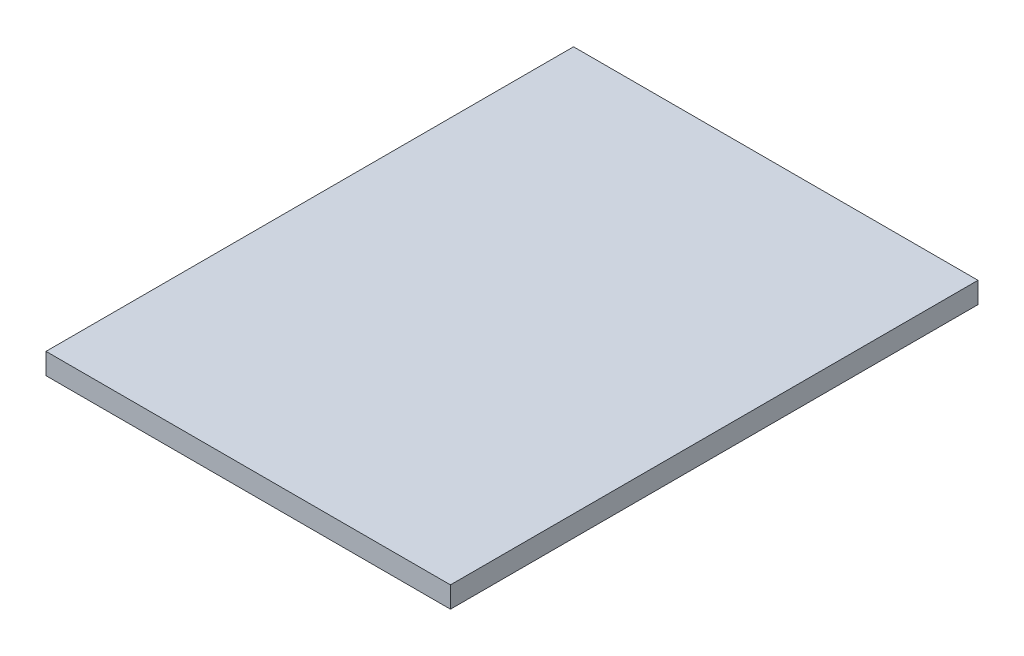
ISO-10303-21;
HEADER;
FILE_DESCRIPTION(('STEP AP214'),'2;1');
FILE_NAME('part.step','',(''),(''),'','','');
FILE_SCHEMA(('AUTOMOTIVE_DESIGN { 1 0 10303 214 1 1 1 1 }'));
ENDSEC;
DATA;
#1=APPLICATION_CONTEXT('core data for automotive mechanical design processes');
#2=APPLICATION_PROTOCOL_DEFINITION('international standard','automotive_design',2000,#1);
#3=PRODUCT_CONTEXT('',#1,'mechanical');
#4=PRODUCT('Part','Part','',(#3));
#5=PRODUCT_RELATED_PRODUCT_CATEGORY('part','',(#4));
#6=PRODUCT_DEFINITION_FORMATION('','',#4);
#7=PRODUCT_DEFINITION_CONTEXT('part definition',#1,'design');
#8=PRODUCT_DEFINITION('design','',#6,#7);
#9=PRODUCT_DEFINITION_SHAPE('','',#8);
#10=(LENGTH_UNIT() NAMED_UNIT(*) SI_UNIT(.MILLI.,.METRE.));
#11=(NAMED_UNIT(*) PLANE_ANGLE_UNIT() SI_UNIT($,.RADIAN.));
#12=(NAMED_UNIT(*) SI_UNIT($,.STERADIAN.) SOLID_ANGLE_UNIT());
#13=UNCERTAINTY_MEASURE_WITH_UNIT(LENGTH_MEASURE(1.E-05),#10,'distance_accuracy_value','');
#14=(GEOMETRIC_REPRESENTATION_CONTEXT(3) GLOBAL_UNCERTAINTY_ASSIGNED_CONTEXT((#13)) GLOBAL_UNIT_ASSIGNED_CONTEXT((#10,
#11,#12)) REPRESENTATION_CONTEXT('',''));
#15=CARTESIAN_POINT('',(0.,0.,0.));
#16=DIRECTION('',(0.,0.,1.));
#17=DIRECTION('',(1.,0.,0.));
#18=AXIS2_PLACEMENT_3D('',#15,#16,#17);
#19=CARTESIAN_POINT('',(-57.5,-6.,75.));
#20=DIRECTION('',(-1.,0.,0.));
#21=DIRECTION('',(0.,0.,1.));
#22=AXIS2_PLACEMENT_3D('',#19,#20,#21);
#23=PLANE('',#22);
#24=DIRECTION('',(0.,0.,1.));
#25=VECTOR('',#24,1.);
#26=CARTESIAN_POINT('',(-57.5,0.,75.));
#27=LINE('',#26,#25);
#28=CARTESIAN_POINT('',(-57.5,0.,-75.));
#29=VERTEX_POINT('',#28);
#30=CARTESIAN_POINT('',(-57.5,0.,75.));
#31=VERTEX_POINT('',#30);
#32=EDGE_CURVE('E100',#29,#31,#27,.T.);
#33=ORIENTED_EDGE('',*,*,#32,.F.);
#34=DIRECTION('',(0.,1.,0.));
#35=VECTOR('',#34,1.);
#36=CARTESIAN_POINT('',(-57.5,-6.,-75.));
#37=LINE('',#36,#35);
#38=CARTESIAN_POINT('',(-57.5,-6.,-75.));
#39=VERTEX_POINT('',#38);
#40=EDGE_CURVE('E11',#39,#29,#37,.T.);
#41=ORIENTED_EDGE('',*,*,#40,.F.);
#42=DIRECTION('',(0.,0.,1.));
#43=VECTOR('',#42,1.);
#44=CARTESIAN_POINT('',(-57.5,-6.,75.));
#45=LINE('',#44,#43);
#46=CARTESIAN_POINT('',(-57.5,-6.,75.));
#47=VERTEX_POINT('',#46);
#48=EDGE_CURVE('E94',#39,#47,#45,.T.);
#49=ORIENTED_EDGE('',*,*,#48,.T.);
#50=DIRECTION('',(0.,1.,0.));
#51=VECTOR('',#50,1.);
#52=CARTESIAN_POINT('',(-57.5,-6.,75.));
#53=LINE('',#52,#51);
#54=EDGE_CURVE('E39',#47,#31,#53,.T.);
#55=ORIENTED_EDGE('',*,*,#54,.T.);
#56=EDGE_LOOP('',(#33,#41,#49,#55));
#57=FACE_BOUND('',#56,.T.);
#58=ADVANCED_FACE('F36',(#57),#23,.T.);
#59=CARTESIAN_POINT('',(-57.5,-6.,-75.));
#60=DIRECTION('',(0.,0.,-1.));
#61=DIRECTION('',(-1.,0.,0.));
#62=AXIS2_PLACEMENT_3D('',#59,#60,#61);
#63=PLANE('',#62);
#64=DIRECTION('',(-1.,0.,0.));
#65=VECTOR('',#64,1.);
#66=CARTESIAN_POINT('',(-57.5,0.,-75.));
#67=LINE('',#66,#65);
#68=CARTESIAN_POINT('',(57.5,0.,-75.));
#69=VERTEX_POINT('',#68);
#70=EDGE_CURVE('E96',#69,#29,#67,.T.);
#71=ORIENTED_EDGE('',*,*,#70,.F.);
#72=DIRECTION('',(0.,1.,0.));
#73=VECTOR('',#72,1.);
#74=CARTESIAN_POINT('',(57.5,-6.,-75.));
#75=LINE('',#74,#73);
#76=CARTESIAN_POINT('',(57.5,-6.,-75.));
#77=VERTEX_POINT('',#76);
#78=EDGE_CURVE('E45',#77,#69,#75,.T.);
#79=ORIENTED_EDGE('',*,*,#78,.F.);
#80=DIRECTION('',(-1.,0.,0.));
#81=VECTOR('',#80,1.);
#82=CARTESIAN_POINT('',(-57.5,-6.,-75.));
#83=LINE('',#82,#81);
#84=EDGE_CURVE('E91',#77,#39,#83,.T.);
#85=ORIENTED_EDGE('',*,*,#84,.T.);
#86=ORIENTED_EDGE('',*,*,#40,.T.);
#87=EDGE_LOOP('',(#71,#79,#85,#86));
#88=FACE_BOUND('',#87,.T.);
#89=ADVANCED_FACE('F110',(#88),#63,.T.);
#90=CARTESIAN_POINT('',(57.5,-6.,75.));
#91=DIRECTION('',(1.,0.,0.));
#92=DIRECTION('',(0.,0.,-1.));
#93=AXIS2_PLACEMENT_3D('',#90,#91,#92);
#94=PLANE('',#93);
#95=DIRECTION('',(0.,0.,-1.));
#96=VECTOR('',#95,1.);
#97=CARTESIAN_POINT('',(57.5,0.,75.));
#98=LINE('',#97,#96);
#99=CARTESIAN_POINT('',(57.5,0.,75.));
#100=VERTEX_POINT('',#99);
#101=EDGE_CURVE('E86',#100,#69,#98,.T.);
#102=ORIENTED_EDGE('',*,*,#101,.F.);
#103=DIRECTION('',(0.,1.,0.));
#104=VECTOR('',#103,1.);
#105=CARTESIAN_POINT('',(57.5,-6.,75.));
#106=LINE('',#105,#104);
#107=CARTESIAN_POINT('',(57.5,-6.,75.));
#108=VERTEX_POINT('',#107);
#109=EDGE_CURVE('E81',#108,#100,#106,.T.);
#110=ORIENTED_EDGE('',*,*,#109,.F.);
#111=DIRECTION('',(0.,0.,-1.));
#112=VECTOR('',#111,1.);
#113=CARTESIAN_POINT('',(57.5,-6.,75.));
#114=LINE('',#113,#112);
#115=EDGE_CURVE('E84',#108,#77,#114,.T.);
#116=ORIENTED_EDGE('',*,*,#115,.T.);
#117=ORIENTED_EDGE('',*,*,#78,.T.);
#118=EDGE_LOOP('',(#102,#110,#116,#117));
#119=FACE_BOUND('',#118,.T.);
#120=ADVANCED_FACE('F83',(#119),#94,.T.);
#121=CARTESIAN_POINT('',(-57.5,-6.,75.));
#122=DIRECTION('',(0.,0.,1.));
#123=DIRECTION('',(1.,0.,0.));
#124=AXIS2_PLACEMENT_3D('',#121,#122,#123);
#125=PLANE('',#124);
#126=DIRECTION('',(1.,0.,0.));
#127=VECTOR('',#126,1.);
#128=CARTESIAN_POINT('',(-57.5,0.,75.));
#129=LINE('',#128,#127);
#130=EDGE_CURVE('E103',#31,#100,#129,.T.);
#131=ORIENTED_EDGE('',*,*,#130,.F.);
#132=ORIENTED_EDGE('',*,*,#54,.F.);
#133=DIRECTION('',(1.,0.,0.));
#134=VECTOR('',#133,1.);
#135=CARTESIAN_POINT('',(-57.5,-6.,75.));
#136=LINE('',#135,#134);
#137=EDGE_CURVE('E90',#47,#108,#136,.T.);
#138=ORIENTED_EDGE('',*,*,#137,.T.);
#139=ORIENTED_EDGE('',*,*,#109,.T.);
#140=EDGE_LOOP('',(#131,#132,#138,#139));
#141=FACE_BOUND('',#140,.T.);
#142=ADVANCED_FACE('F93',(#141),#125,.T.);
#143=CARTESIAN_POINT('',(0.,-6.,0.));
#144=DIRECTION('',(0.,-1.,0.));
#145=DIRECTION('',(0.,0.,-1.));
#146=AXIS2_PLACEMENT_3D('',#143,#144,#145);
#147=PLANE('',#146);
#148=ORIENTED_EDGE('',*,*,#48,.F.);
#149=ORIENTED_EDGE('',*,*,#84,.F.);
#150=ORIENTED_EDGE('',*,*,#115,.F.);
#151=ORIENTED_EDGE('',*,*,#137,.F.);
#152=EDGE_LOOP('',(#148,#149,#150,#151));
#153=FACE_BOUND('',#152,.T.);
#154=ADVANCED_FACE('F89',(#153),#147,.T.);
#155=CARTESIAN_POINT('',(0.,0.,0.));
#156=DIRECTION('',(0.,-1.,0.));
#157=DIRECTION('',(0.,0.,-1.));
#158=AXIS2_PLACEMENT_3D('',#155,#156,#157);
#159=PLANE('',#158);
#160=ORIENTED_EDGE('',*,*,#32,.T.);
#161=ORIENTED_EDGE('',*,*,#130,.T.);
#162=ORIENTED_EDGE('',*,*,#101,.T.);
#163=ORIENTED_EDGE('',*,*,#70,.T.);
#164=EDGE_LOOP('',(#160,#161,#162,#163));
#165=FACE_BOUND('',#164,.T.);
#166=ADVANCED_FACE('F109',(#165),#159,.F.);
#167=CLOSED_SHELL('',(#58,#89,#120,#142,#154,#166));
#168=MANIFOLD_SOLID_BREP('B2',#167);
#169=ADVANCED_BREP_SHAPE_REPRESENTATION('',(#18,#168),#14);
#170=SHAPE_DEFINITION_REPRESENTATION(#9,#169);
ENDSEC;
END-ISO-10303-21;
